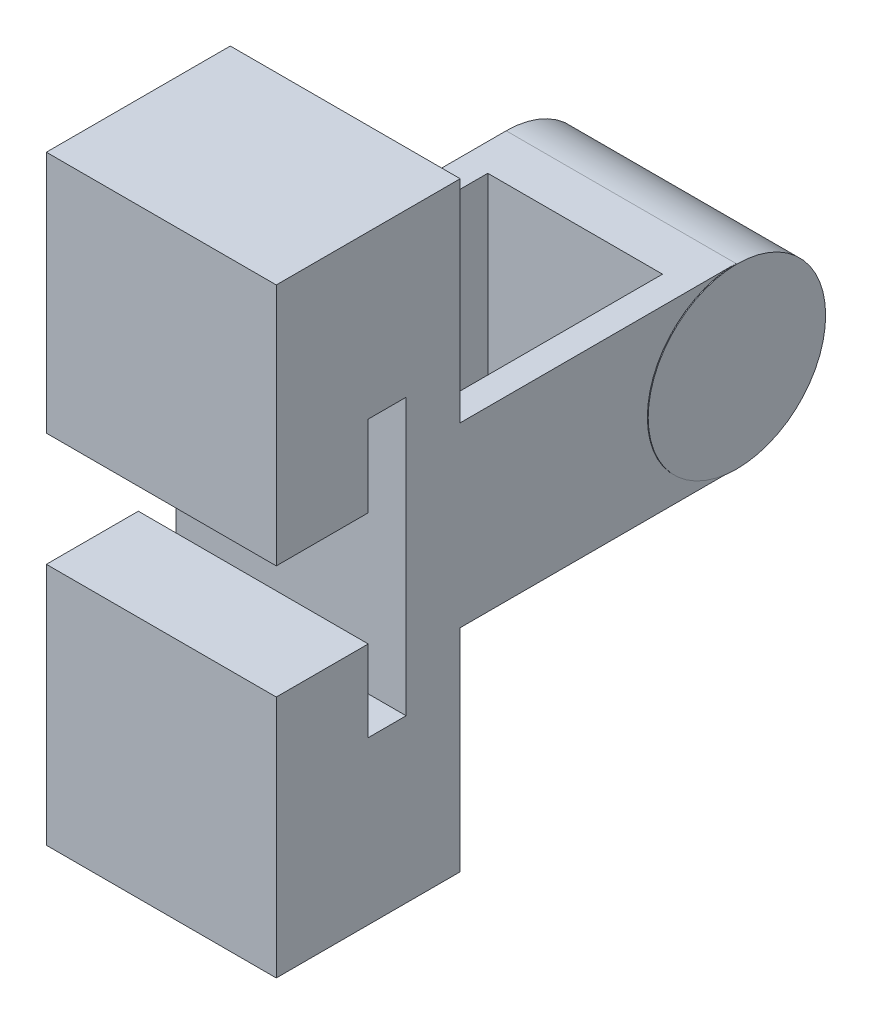
ISO-10303-21;
HEADER;
FILE_DESCRIPTION(('STEP AP214'),'2;1');
FILE_NAME('part.step','',(''),(''),'','','');
FILE_SCHEMA(('AUTOMOTIVE_DESIGN { 1 0 10303 214 1 1 1 1 }'));
ENDSEC;
DATA;
#1=APPLICATION_CONTEXT('core data for automotive mechanical design processes');
#2=APPLICATION_PROTOCOL_DEFINITION('international standard','automotive_design',2000,#1);
#3=PRODUCT_CONTEXT('',#1,'mechanical');
#4=PRODUCT('Part','Part','',(#3));
#5=PRODUCT_RELATED_PRODUCT_CATEGORY('part','',(#4));
#6=PRODUCT_DEFINITION_FORMATION('','',#4);
#7=PRODUCT_DEFINITION_CONTEXT('part definition',#1,'design');
#8=PRODUCT_DEFINITION('design','',#6,#7);
#9=PRODUCT_DEFINITION_SHAPE('','',#8);
#10=(LENGTH_UNIT() NAMED_UNIT(*) SI_UNIT(.MILLI.,.METRE.));
#11=(NAMED_UNIT(*) PLANE_ANGLE_UNIT() SI_UNIT($,.RADIAN.));
#12=(NAMED_UNIT(*) SI_UNIT($,.STERADIAN.) SOLID_ANGLE_UNIT());
#13=UNCERTAINTY_MEASURE_WITH_UNIT(LENGTH_MEASURE(1.E-05),#10,'distance_accuracy_value','');
#14=(GEOMETRIC_REPRESENTATION_CONTEXT(3) GLOBAL_UNCERTAINTY_ASSIGNED_CONTEXT((#13)) GLOBAL_UNIT_ASSIGNED_CONTEXT((#10,
#11,#12)) REPRESENTATION_CONTEXT('',''));
#15=CARTESIAN_POINT('',(0.,0.,0.));
#16=DIRECTION('',(0.,0.,1.));
#17=DIRECTION('',(1.,0.,0.));
#18=AXIS2_PLACEMENT_3D('',#15,#16,#17);
#19=CARTESIAN_POINT('',(0.,-38.1,0.));
#20=DIRECTION('',(0.,-1.,0.));
#21=DIRECTION('',(-1.,0.,0.));
#22=AXIS2_PLACEMENT_3D('',#19,#20,#21);
#23=PLANE('',#22);
#24=DIRECTION('',(-1.,0.,0.));
#25=VECTOR('',#24,1.);
#26=CARTESIAN_POINT('',(0.,-38.1,101.6));
#27=LINE('',#26,#25);
#28=CARTESIAN_POINT('',(0.,-38.1,101.6));
#29=VERTEX_POINT('',#28);
#30=CARTESIAN_POINT('',(-63.5,-38.1,101.6));
#31=VERTEX_POINT('',#30);
#32=EDGE_CURVE('E383',#29,#31,#27,.T.);
#33=ORIENTED_EDGE('',*,*,#32,.F.);
#34=DIRECTION('',(0.,0.,-1.));
#35=VECTOR('',#34,1.);
#36=CARTESIAN_POINT('',(0.,-38.1,127.));
#37=LINE('',#36,#35);
#38=CARTESIAN_POINT('',(0.,-38.1,91.1297825490581));
#39=VERTEX_POINT('',#38);
#40=EDGE_CURVE('E334',#29,#39,#37,.T.);
#41=ORIENTED_EDGE('',*,*,#40,.T.);
#42=DIRECTION('',(1.,0.,0.));
#43=VECTOR('',#42,1.);
#44=CARTESIAN_POINT('',(-63.5,-38.1,91.1297825490581));
#45=LINE('',#44,#43);
#46=CARTESIAN_POINT('',(-63.5,-38.1,91.1297825490581));
#47=VERTEX_POINT('',#46);
#48=EDGE_CURVE('E287',#47,#39,#45,.T.);
#49=ORIENTED_EDGE('',*,*,#48,.F.);
#50=DIRECTION('',(0.,0.,1.));
#51=VECTOR('',#50,1.);
#52=CARTESIAN_POINT('',(-63.5,-38.1,76.2));
#53=LINE('',#52,#51);
#54=EDGE_CURVE('E330',#47,#31,#53,.T.);
#55=ORIENTED_EDGE('',*,*,#54,.T.);
#56=EDGE_LOOP('',(#33,#41,#49,#55));
#57=FACE_BOUND('',#56,.T.);
#58=ADVANCED_FACE('F47',(#57),#23,.F.);
#59=CARTESIAN_POINT('',(0.,38.1,0.));
#60=DIRECTION('',(0.,1.,0.));
#61=DIRECTION('',(-1.,0.,0.));
#62=AXIS2_PLACEMENT_3D('',#59,#60,#61);
#63=PLANE('',#62);
#64=DIRECTION('',(1.,0.,0.));
#65=VECTOR('',#64,1.);
#66=CARTESIAN_POINT('',(0.,38.1,101.6));
#67=LINE('',#66,#65);
#68=CARTESIAN_POINT('',(-63.5,38.1,101.6));
#69=VERTEX_POINT('',#68);
#70=CARTESIAN_POINT('',(0.,38.1,101.6));
#71=VERTEX_POINT('',#70);
#72=EDGE_CURVE('E357',#69,#71,#67,.T.);
#73=ORIENTED_EDGE('',*,*,#72,.F.);
#74=DIRECTION('',(0.,0.,1.));
#75=VECTOR('',#74,1.);
#76=CARTESIAN_POINT('',(-63.5,38.1,76.2));
#77=LINE('',#76,#75);
#78=CARTESIAN_POINT('',(-63.5,38.1,91.1297825490581));
#79=VERTEX_POINT('',#78);
#80=EDGE_CURVE('E305',#79,#69,#77,.T.);
#81=ORIENTED_EDGE('',*,*,#80,.F.);
#82=DIRECTION('',(-1.,0.,0.));
#83=VECTOR('',#82,1.);
#84=CARTESIAN_POINT('',(0.,38.1,91.1297825490581));
#85=LINE('',#84,#83);
#86=CARTESIAN_POINT('',(0.,38.1,91.1297825490581));
#87=VERTEX_POINT('',#86);
#88=EDGE_CURVE('E295',#87,#79,#85,.T.);
#89=ORIENTED_EDGE('',*,*,#88,.F.);
#90=DIRECTION('',(0.,0.,-1.));
#91=VECTOR('',#90,1.);
#92=CARTESIAN_POINT('',(0.,38.1,127.));
#93=LINE('',#92,#91);
#94=EDGE_CURVE('E310',#71,#87,#93,.T.);
#95=ORIENTED_EDGE('',*,*,#94,.F.);
#96=EDGE_LOOP('',(#73,#81,#89,#95));
#97=FACE_BOUND('',#96,.T.);
#98=ADVANCED_FACE('F431',(#97),#63,.F.);
#99=CARTESIAN_POINT('',(0.2286,0.,0.));
#100=DIRECTION('',(-1.,0.,0.));
#101=DIRECTION('',(0.,0.,1.));
#102=AXIS2_PLACEMENT_3D('',#99,#100,#101);
#103=CYLINDRICAL_SURFACE('',#102,24.5059058177304);
#104=CARTESIAN_POINT('',(0.2286,0.,0.));
#105=DIRECTION('',(1.,0.,0.));
#106=DIRECTION('',(0.,0.,-1.));
#107=AXIS2_PLACEMENT_3D('',#104,#105,#106);
#108=CIRCLE('',#107,24.5059058177304);
#109=CARTESIAN_POINT('',(0.2286,0.,-24.5059058177304));
#110=VERTEX_POINT('',#109);
#111=EDGE_CURVE('E56',#110,#110,#108,.T.);
#112=ORIENTED_EDGE('',*,*,#111,.F.);
#113=EDGE_LOOP('',(#112));
#114=FACE_BOUND('',#113,.T.);
#115=CARTESIAN_POINT('',(0.,0.,0.));
#116=DIRECTION('',(1.,0.,0.));
#117=DIRECTION('',(0.,0.,-1.));
#118=AXIS2_PLACEMENT_3D('',#115,#116,#117);
#119=CIRCLE('',#118,24.5059058177304);
#120=CARTESIAN_POINT('',(0.,24.5059058177304,0.));
#121=VERTEX_POINT('',#120);
#122=CARTESIAN_POINT('',(0.,-24.5059058177304,0.));
#123=VERTEX_POINT('',#122);
#124=EDGE_CURVE('E217',#121,#123,#119,.T.);
#125=ORIENTED_EDGE('',*,*,#124,.T.);
#126=DIRECTION('',(1.,0.,0.));
#127=VECTOR('',#126,1.);
#128=CARTESIAN_POINT('',(-63.5,-24.5059058177304,0.));
#129=LINE('',#128,#127);
#130=CARTESIAN_POINT('',(-63.5,-24.5059058177304,0.));
#131=VERTEX_POINT('',#130);
#132=EDGE_CURVE('E211',#131,#123,#129,.T.);
#133=ORIENTED_EDGE('',*,*,#132,.F.);
#134=CARTESIAN_POINT('',(-63.5,0.,0.));
#135=DIRECTION('',(-1.,0.,0.));
#136=DIRECTION('',(0.,0.,1.));
#137=AXIS2_PLACEMENT_3D('',#134,#135,#136);
#138=CIRCLE('',#137,24.5059058177304);
#139=CARTESIAN_POINT('',(-63.5,24.5059058177304,0.));
#140=VERTEX_POINT('',#139);
#141=EDGE_CURVE('E252',#140,#131,#138,.T.);
#142=ORIENTED_EDGE('',*,*,#141,.F.);
#143=DIRECTION('',(1.,0.,0.));
#144=VECTOR('',#143,1.);
#145=CARTESIAN_POINT('',(-63.5,24.5059058177304,0.));
#146=LINE('',#145,#144);
#147=EDGE_CURVE('E232',#140,#121,#146,.T.);
#148=ORIENTED_EDGE('',*,*,#147,.T.);
#149=EDGE_LOOP('',(#125,#133,#142,#148));
#150=FACE_BOUND('',#149,.T.);
#151=ADVANCED_FACE('F49',(#114,#150),#103,.T.);
#152=CARTESIAN_POINT('',(0.2286,0.,0.));
#153=DIRECTION('',(1.,0.,0.));
#154=DIRECTION('',(0.,0.,-1.));
#155=AXIS2_PLACEMENT_3D('',#152,#153,#154);
#156=PLANE('',#155);
#157=ORIENTED_EDGE('',*,*,#111,.T.);
#158=EDGE_LOOP('',(#157));
#159=FACE_BOUND('',#158,.T.);
#160=ADVANCED_FACE('F469',(#159),#156,.T.);
#161=CARTESIAN_POINT('',(-63.5,-24.5059058177305,76.2));
#162=DIRECTION('',(0.,1.,0.));
#163=DIRECTION('',(0.,0.,1.));
#164=AXIS2_PLACEMENT_3D('',#161,#162,#163);
#165=PLANE('',#164);
#166=DIRECTION('',(1.,0.,0.));
#167=VECTOR('',#166,1.);
#168=CARTESIAN_POINT('',(-63.5,-24.5059058177305,76.2));
#169=LINE('',#168,#167);
#170=CARTESIAN_POINT('',(-7.61999999999999,-24.5059058177305,76.2));
#171=VERTEX_POINT('',#170);
#172=CARTESIAN_POINT('',(0.,-24.5059058177305,76.2));
#173=VERTEX_POINT('',#172);
#174=EDGE_CURVE('E212',#171,#173,#169,.T.);
#175=ORIENTED_EDGE('',*,*,#174,.F.);
#176=DIRECTION('',(0.,0.,1.));
#177=VECTOR('',#176,1.);
#178=CARTESIAN_POINT('',(-7.62,-24.5059058177305,76.2));
#179=LINE('',#178,#177);
#180=CARTESIAN_POINT('',(-7.61999999999999,-24.5059058177305,12.7));
#181=VERTEX_POINT('',#180);
#182=EDGE_CURVE('E63',#181,#171,#179,.T.);
#183=ORIENTED_EDGE('',*,*,#182,.F.);
#184=DIRECTION('',(1.,0.,0.));
#185=VECTOR('',#184,1.);
#186=CARTESIAN_POINT('',(-7.61999999999999,-24.5059058177305,12.7));
#187=LINE('',#186,#185);
#188=CARTESIAN_POINT('',(-55.88,-24.5059058177305,12.7));
#189=VERTEX_POINT('',#188);
#190=EDGE_CURVE('E204',#189,#181,#187,.T.);
#191=ORIENTED_EDGE('',*,*,#190,.F.);
#192=DIRECTION('',(0.,0.,-1.));
#193=VECTOR('',#192,1.);
#194=CARTESIAN_POINT('',(-55.88,-24.5059058177305,12.7));
#195=LINE('',#194,#193);
#196=CARTESIAN_POINT('',(-55.88,-24.5059058177305,76.2));
#197=VERTEX_POINT('',#196);
#198=EDGE_CURVE('E188',#197,#189,#195,.T.);
#199=ORIENTED_EDGE('',*,*,#198,.F.);
#200=CARTESIAN_POINT('',(-63.5,-24.5059058177305,76.2));
#201=VERTEX_POINT('',#200);
#202=EDGE_CURVE('E201',#201,#197,#169,.T.);
#203=ORIENTED_EDGE('',*,*,#202,.F.);
#204=DIRECTION('',(0.,0.,1.));
#205=VECTOR('',#204,1.);
#206=CARTESIAN_POINT('',(-63.5,-24.5059058177305,76.2));
#207=LINE('',#206,#205);
#208=EDGE_CURVE('E247',#131,#201,#207,.T.);
#209=ORIENTED_EDGE('',*,*,#208,.F.);
#210=ORIENTED_EDGE('',*,*,#132,.T.);
#211=DIRECTION('',(0.,0.,1.));
#212=VECTOR('',#211,1.);
#213=CARTESIAN_POINT('',(0.,-24.5059058177305,76.2));
#214=LINE('',#213,#212);
#215=EDGE_CURVE('E241',#123,#173,#214,.T.);
#216=ORIENTED_EDGE('',*,*,#215,.T.);
#217=EDGE_LOOP('',(#175,#183,#191,#199,#203,#209,#210,#216));
#218=FACE_BOUND('',#217,.T.);
#219=ADVANCED_FACE('F200',(#218),#165,.F.);
#220=CARTESIAN_POINT('',(-63.5,24.5059058177304,0.));
#221=DIRECTION('',(0.,-1.,0.));
#222=DIRECTION('',(0.,0.,-1.));
#223=AXIS2_PLACEMENT_3D('',#220,#221,#222);
#224=PLANE('',#223);
#225=DIRECTION('',(1.,0.,0.));
#226=VECTOR('',#225,1.);
#227=CARTESIAN_POINT('',(-63.5,24.5059058177305,12.7));
#228=LINE('',#227,#226);
#229=CARTESIAN_POINT('',(-55.88,24.5059058177305,12.7));
#230=VERTEX_POINT('',#229);
#231=CARTESIAN_POINT('',(-7.61999999999999,24.5059058177305,12.7));
#232=VERTEX_POINT('',#231);
#233=EDGE_CURVE('E11',#230,#232,#228,.T.);
#234=ORIENTED_EDGE('',*,*,#233,.T.);
#235=DIRECTION('',(0.,0.,1.));
#236=VECTOR('',#235,1.);
#237=CARTESIAN_POINT('',(-7.61999999999999,24.5059058177304,0.));
#238=LINE('',#237,#236);
#239=CARTESIAN_POINT('',(-7.62,24.5059058177305,76.2));
#240=VERTEX_POINT('',#239);
#241=EDGE_CURVE('E388',#232,#240,#238,.T.);
#242=ORIENTED_EDGE('',*,*,#241,.T.);
#243=DIRECTION('',(1.,0.,0.));
#244=VECTOR('',#243,1.);
#245=CARTESIAN_POINT('',(-63.5,24.5059058177305,76.2));
#246=LINE('',#245,#244);
#247=CARTESIAN_POINT('',(0.,24.5059058177305,76.2));
#248=VERTEX_POINT('',#247);
#249=EDGE_CURVE('E265',#240,#248,#246,.T.);
#250=ORIENTED_EDGE('',*,*,#249,.T.);
#251=DIRECTION('',(0.,0.,-1.));
#252=VECTOR('',#251,1.);
#253=CARTESIAN_POINT('',(0.,24.5059058177304,0.));
#254=LINE('',#253,#252);
#255=EDGE_CURVE('E237',#248,#121,#254,.T.);
#256=ORIENTED_EDGE('',*,*,#255,.T.);
#257=ORIENTED_EDGE('',*,*,#147,.F.);
#258=DIRECTION('',(0.,0.,-1.));
#259=VECTOR('',#258,1.);
#260=CARTESIAN_POINT('',(-63.5,24.5059058177304,0.));
#261=LINE('',#260,#259);
#262=CARTESIAN_POINT('',(-63.5,24.5059058177305,76.2));
#263=VERTEX_POINT('',#262);
#264=EDGE_CURVE('E251',#263,#140,#261,.T.);
#265=ORIENTED_EDGE('',*,*,#264,.F.);
#266=CARTESIAN_POINT('',(-55.88,24.5059058177305,76.2));
#267=VERTEX_POINT('',#266);
#268=EDGE_CURVE('E219',#263,#267,#246,.T.);
#269=ORIENTED_EDGE('',*,*,#268,.T.);
#270=DIRECTION('',(0.,0.,-1.));
#271=VECTOR('',#270,1.);
#272=CARTESIAN_POINT('',(-55.88,24.5059058177304,0.));
#273=LINE('',#272,#271);
#274=EDGE_CURVE('E191',#267,#230,#273,.T.);
#275=ORIENTED_EDGE('',*,*,#274,.T.);
#276=EDGE_LOOP('',(#234,#242,#250,#256,#257,#265,#269,#275));
#277=FACE_BOUND('',#276,.T.);
#278=ADVANCED_FACE('F271',(#277),#224,.F.);
#279=CARTESIAN_POINT('',(-63.5,0.,0.));
#280=DIRECTION('',(-1.,0.,0.));
#281=DIRECTION('',(0.,0.,1.));
#282=AXIS2_PLACEMENT_3D('',#279,#280,#281);
#283=PLANE('',#282);
#284=ORIENTED_EDGE('',*,*,#141,.T.);
#285=ORIENTED_EDGE('',*,*,#208,.T.);
#286=DIRECTION('',(0.,-1.,0.));
#287=VECTOR('',#286,1.);
#288=CARTESIAN_POINT('',(-63.5,38.1,76.2));
#289=LINE('',#288,#287);
#290=CARTESIAN_POINT('',(-63.5,-82.8893476471741,76.2));
#291=VERTEX_POINT('',#290);
#292=EDGE_CURVE('E209',#201,#291,#289,.T.);
#293=ORIENTED_EDGE('',*,*,#292,.T.);
#294=DIRECTION('',(0.,0.,1.));
#295=VECTOR('',#294,1.);
#296=CARTESIAN_POINT('',(-63.5,-82.8893476471741,76.2));
#297=LINE('',#296,#295);
#298=CARTESIAN_POINT('',(-63.5,-82.8893476471741,127.));
#299=VERTEX_POINT('',#298);
#300=EDGE_CURVE('E340',#291,#299,#297,.T.);
#301=ORIENTED_EDGE('',*,*,#300,.T.);
#302=DIRECTION('',(0.,1.,0.));
#303=VECTOR('',#302,1.);
#304=CARTESIAN_POINT('',(-63.5,-82.8893476471741,127.));
#305=LINE('',#304,#303);
#306=CARTESIAN_POINT('',(-63.5,-15.68196,127.));
#307=VERTEX_POINT('',#306);
#308=EDGE_CURVE('E326',#299,#307,#305,.T.);
#309=ORIENTED_EDGE('',*,*,#308,.T.);
#310=DIRECTION('',(0.,0.,1.));
#311=VECTOR('',#310,1.);
#312=CARTESIAN_POINT('',(-63.5,-15.68196,127.));
#313=LINE('',#312,#311);
#314=CARTESIAN_POINT('',(-63.5,-15.68196,101.6));
#315=VERTEX_POINT('',#314);
#316=EDGE_CURVE('E392',#315,#307,#313,.T.);
#317=ORIENTED_EDGE('',*,*,#316,.F.);
#318=DIRECTION('',(0.,-1.,0.));
#319=VECTOR('',#318,1.);
#320=CARTESIAN_POINT('',(-63.5,-15.68196,101.6));
#321=LINE('',#320,#319);
#322=EDGE_CURVE('E378',#315,#31,#321,.T.);
#323=ORIENTED_EDGE('',*,*,#322,.T.);
#324=ORIENTED_EDGE('',*,*,#54,.F.);
#325=DIRECTION('',(0.,-1.,0.));
#326=VECTOR('',#325,1.);
#327=CARTESIAN_POINT('',(-63.5,38.1,91.1297825490581));
#328=LINE('',#327,#326);
#329=EDGE_CURVE('E291',#79,#47,#328,.T.);
#330=ORIENTED_EDGE('',*,*,#329,.F.);
#331=ORIENTED_EDGE('',*,*,#80,.T.);
#332=DIRECTION('',(0.,1.,0.));
#333=VECTOR('',#332,1.);
#334=CARTESIAN_POINT('',(-63.5,15.68196,101.6));
#335=LINE('',#334,#333);
#336=CARTESIAN_POINT('',(-63.5,15.68196,101.6));
#337=VERTEX_POINT('',#336);
#338=EDGE_CURVE('E337',#337,#69,#335,.T.);
#339=ORIENTED_EDGE('',*,*,#338,.F.);
#340=DIRECTION('',(0.,0.,-1.));
#341=VECTOR('',#340,1.);
#342=CARTESIAN_POINT('',(-63.5,15.68196,101.6));
#343=LINE('',#342,#341);
#344=CARTESIAN_POINT('',(-63.5,15.68196,127.));
#345=VERTEX_POINT('',#344);
#346=EDGE_CURVE('E360',#345,#337,#343,.T.);
#347=ORIENTED_EDGE('',*,*,#346,.F.);
#348=DIRECTION('',(0.,-1.,0.));
#349=VECTOR('',#348,1.);
#350=CARTESIAN_POINT('',(-63.5,82.8893476471741,127.));
#351=LINE('',#350,#349);
#352=CARTESIAN_POINT('',(-63.5,82.8893476471741,127.));
#353=VERTEX_POINT('',#352);
#354=EDGE_CURVE('E282',#353,#345,#351,.T.);
#355=ORIENTED_EDGE('',*,*,#354,.F.);
#356=DIRECTION('',(0.,0.,1.));
#357=VECTOR('',#356,1.);
#358=CARTESIAN_POINT('',(-63.5,82.8893476471741,76.2));
#359=LINE('',#358,#357);
#360=CARTESIAN_POINT('',(-63.5,82.8893476471741,76.2));
#361=VERTEX_POINT('',#360);
#362=EDGE_CURVE('E277',#361,#353,#359,.T.);
#363=ORIENTED_EDGE('',*,*,#362,.F.);
#364=EDGE_CURVE('E274',#361,#263,#289,.T.);
#365=ORIENTED_EDGE('',*,*,#364,.T.);
#366=ORIENTED_EDGE('',*,*,#264,.T.);
#367=EDGE_LOOP('',(#284,#285,#293,#301,#309,#317,#323,#324,#330,#331,#339,#347,#355,#363,#365,#366));
#368=FACE_BOUND('',#367,.T.);
#369=ADVANCED_FACE('F254',(#368),#283,.T.);
#370=CARTESIAN_POINT('',(0.,0.,0.));
#371=DIRECTION('',(-1.,0.,0.));
#372=DIRECTION('',(0.,0.,1.));
#373=AXIS2_PLACEMENT_3D('',#370,#371,#372);
#374=PLANE('',#373);
#375=ORIENTED_EDGE('',*,*,#124,.F.);
#376=ORIENTED_EDGE('',*,*,#255,.F.);
#377=DIRECTION('',(0.,1.,0.));
#378=VECTOR('',#377,1.);
#379=CARTESIAN_POINT('',(0.,-38.1,76.2));
#380=LINE('',#379,#378);
#381=CARTESIAN_POINT('',(0.,82.8893476471742,76.2));
#382=VERTEX_POINT('',#381);
#383=EDGE_CURVE('E279',#248,#382,#380,.T.);
#384=ORIENTED_EDGE('',*,*,#383,.T.);
#385=DIRECTION('',(0.,0.,-1.));
#386=VECTOR('',#385,1.);
#387=CARTESIAN_POINT('',(0.,82.8893476471742,127.));
#388=LINE('',#387,#386);
#389=CARTESIAN_POINT('',(0.,82.8893476471742,127.));
#390=VERTEX_POINT('',#389);
#391=EDGE_CURVE('E309',#390,#382,#388,.T.);
#392=ORIENTED_EDGE('',*,*,#391,.F.);
#393=DIRECTION('',(0.,-1.,0.));
#394=VECTOR('',#393,1.);
#395=CARTESIAN_POINT('',(0.,82.8893476471742,127.));
#396=LINE('',#395,#394);
#397=CARTESIAN_POINT('',(0.,15.68196,127.));
#398=VERTEX_POINT('',#397);
#399=EDGE_CURVE('E301',#390,#398,#396,.T.);
#400=ORIENTED_EDGE('',*,*,#399,.T.);
#401=DIRECTION('',(0.,0.,1.));
#402=VECTOR('',#401,1.);
#403=CARTESIAN_POINT('',(0.,15.68196,127.));
#404=LINE('',#403,#402);
#405=CARTESIAN_POINT('',(0.,15.68196,101.6));
#406=VERTEX_POINT('',#405);
#407=EDGE_CURVE('E365',#406,#398,#404,.T.);
#408=ORIENTED_EDGE('',*,*,#407,.F.);
#409=DIRECTION('',(0.,1.,0.));
#410=VECTOR('',#409,1.);
#411=CARTESIAN_POINT('',(0.,15.68196,101.6));
#412=LINE('',#411,#410);
#413=EDGE_CURVE('E352',#406,#71,#412,.T.);
#414=ORIENTED_EDGE('',*,*,#413,.T.);
#415=ORIENTED_EDGE('',*,*,#94,.T.);
#416=DIRECTION('',(0.,1.,0.));
#417=VECTOR('',#416,1.);
#418=CARTESIAN_POINT('',(0.,-38.1,91.1297825490581));
#419=LINE('',#418,#417);
#420=EDGE_CURVE('E245',#39,#87,#419,.T.);
#421=ORIENTED_EDGE('',*,*,#420,.F.);
#422=ORIENTED_EDGE('',*,*,#40,.F.);
#423=DIRECTION('',(0.,-1.,0.));
#424=VECTOR('',#423,1.);
#425=CARTESIAN_POINT('',(0.,-15.68196,101.6));
#426=LINE('',#425,#424);
#427=CARTESIAN_POINT('',(0.,-15.68196,101.6));
#428=VERTEX_POINT('',#427);
#429=EDGE_CURVE('E361',#428,#29,#426,.T.);
#430=ORIENTED_EDGE('',*,*,#429,.F.);
#431=DIRECTION('',(0.,0.,-1.));
#432=VECTOR('',#431,1.);
#433=CARTESIAN_POINT('',(0.,-15.68196,127.));
#434=LINE('',#433,#432);
#435=CARTESIAN_POINT('',(0.,-15.68196,127.));
#436=VERTEX_POINT('',#435);
#437=EDGE_CURVE('E387',#436,#428,#434,.T.);
#438=ORIENTED_EDGE('',*,*,#437,.F.);
#439=DIRECTION('',(0.,1.,0.));
#440=VECTOR('',#439,1.);
#441=CARTESIAN_POINT('',(0.,-82.8893476471742,127.));
#442=LINE('',#441,#440);
#443=CARTESIAN_POINT('',(0.,-82.8893476471742,127.));
#444=VERTEX_POINT('',#443);
#445=EDGE_CURVE('E313',#444,#436,#442,.T.);
#446=ORIENTED_EDGE('',*,*,#445,.F.);
#447=DIRECTION('',(0.,0.,-1.));
#448=VECTOR('',#447,1.);
#449=CARTESIAN_POINT('',(0.,-82.8893476471742,127.));
#450=LINE('',#449,#448);
#451=CARTESIAN_POINT('',(0.,-82.8893476471742,76.2));
#452=VERTEX_POINT('',#451);
#453=EDGE_CURVE('E333',#444,#452,#450,.T.);
#454=ORIENTED_EDGE('',*,*,#453,.T.);
#455=EDGE_CURVE('E243',#452,#173,#380,.T.);
#456=ORIENTED_EDGE('',*,*,#455,.T.);
#457=ORIENTED_EDGE('',*,*,#215,.F.);
#458=EDGE_LOOP('',(#375,#376,#384,#392,#400,#408,#414,#415,#421,#422,#430,#438,#446,#454,#456,#457));
#459=FACE_BOUND('',#458,.T.);
#460=ADVANCED_FACE('F236',(#459),#374,.F.);
#461=CARTESIAN_POINT('',(0.,0.,76.2));
#462=DIRECTION('',(0.,0.,1.));
#463=DIRECTION('',(1.,0.,0.));
#464=AXIS2_PLACEMENT_3D('',#461,#462,#463);
#465=PLANE('',#464);
#466=ORIENTED_EDGE('',*,*,#292,.F.);
#467=ORIENTED_EDGE('',*,*,#202,.T.);
#468=DIRECTION('',(0.,-1.,0.));
#469=VECTOR('',#468,1.);
#470=CARTESIAN_POINT('',(-55.88,82.8893476471742,76.2));
#471=LINE('',#470,#469);
#472=EDGE_CURVE('E71',#267,#197,#471,.T.);
#473=ORIENTED_EDGE('',*,*,#472,.F.);
#474=ORIENTED_EDGE('',*,*,#268,.F.);
#475=ORIENTED_EDGE('',*,*,#364,.F.);
#476=DIRECTION('',(-1.,0.,0.));
#477=VECTOR('',#476,1.);
#478=CARTESIAN_POINT('',(0.,82.8893476471742,76.2));
#479=LINE('',#478,#477);
#480=EDGE_CURVE('E318',#382,#361,#479,.T.);
#481=ORIENTED_EDGE('',*,*,#480,.F.);
#482=ORIENTED_EDGE('',*,*,#383,.F.);
#483=ORIENTED_EDGE('',*,*,#249,.F.);
#484=DIRECTION('',(0.,-1.,0.));
#485=VECTOR('',#484,1.);
#486=CARTESIAN_POINT('',(-7.62,82.8893476471742,76.2));
#487=LINE('',#486,#485);
#488=EDGE_CURVE('E195',#240,#171,#487,.T.);
#489=ORIENTED_EDGE('',*,*,#488,.T.);
#490=ORIENTED_EDGE('',*,*,#174,.T.);
#491=ORIENTED_EDGE('',*,*,#455,.F.);
#492=DIRECTION('',(-1.,0.,0.));
#493=VECTOR('',#492,1.);
#494=CARTESIAN_POINT('',(0.,-82.8893476471742,76.2));
#495=LINE('',#494,#493);
#496=EDGE_CURVE('E329',#452,#291,#495,.T.);
#497=ORIENTED_EDGE('',*,*,#496,.T.);
#498=EDGE_LOOP('',(#466,#467,#473,#474,#475,#481,#482,#483,#489,#490,#491,#497));
#499=FACE_BOUND('',#498,.T.);
#500=ADVANCED_FACE('F207',(#499),#465,.F.);
#501=CARTESIAN_POINT('',(0.,0.,91.1297825490581));
#502=DIRECTION('',(0.,0.,1.));
#503=DIRECTION('',(1.,0.,0.));
#504=AXIS2_PLACEMENT_3D('',#501,#502,#503);
#505=PLANE('',#504);
#506=ORIENTED_EDGE('',*,*,#88,.T.);
#507=ORIENTED_EDGE('',*,*,#329,.T.);
#508=ORIENTED_EDGE('',*,*,#48,.T.);
#509=ORIENTED_EDGE('',*,*,#420,.T.);
#510=EDGE_LOOP('',(#506,#507,#508,#509));
#511=FACE_BOUND('',#510,.T.);
#512=ADVANCED_FACE('F456',(#511),#505,.T.);
#513=CARTESIAN_POINT('',(-63.5,82.8893476471741,127.));
#514=DIRECTION('',(0.,0.,-1.));
#515=DIRECTION('',(-1.,0.,0.));
#516=AXIS2_PLACEMENT_3D('',#513,#514,#515);
#517=PLANE('',#516);
#518=ORIENTED_EDGE('',*,*,#354,.T.);
#519=DIRECTION('',(-1.,0.,0.));
#520=VECTOR('',#519,1.);
#521=CARTESIAN_POINT('',(-63.5,15.68196,127.));
#522=LINE('',#521,#520);
#523=EDGE_CURVE('E356',#398,#345,#522,.T.);
#524=ORIENTED_EDGE('',*,*,#523,.F.);
#525=ORIENTED_EDGE('',*,*,#399,.F.);
#526=DIRECTION('',(1.,0.,0.));
#527=VECTOR('',#526,1.);
#528=CARTESIAN_POINT('',(-63.5,82.8893476471741,127.));
#529=LINE('',#528,#527);
#530=EDGE_CURVE('E304',#353,#390,#529,.T.);
#531=ORIENTED_EDGE('',*,*,#530,.F.);
#532=EDGE_LOOP('',(#518,#524,#525,#531));
#533=FACE_BOUND('',#532,.T.);
#534=ADVANCED_FACE('F451',(#533),#517,.F.);
#535=CARTESIAN_POINT('',(0.,82.8893476471742,0.));
#536=DIRECTION('',(0.,1.,0.));
#537=DIRECTION('',(-1.,0.,0.));
#538=AXIS2_PLACEMENT_3D('',#535,#536,#537);
#539=PLANE('',#538);
#540=ORIENTED_EDGE('',*,*,#391,.T.);
#541=ORIENTED_EDGE('',*,*,#480,.T.);
#542=ORIENTED_EDGE('',*,*,#362,.T.);
#543=ORIENTED_EDGE('',*,*,#530,.T.);
#544=EDGE_LOOP('',(#540,#541,#542,#543));
#545=FACE_BOUND('',#544,.T.);
#546=ADVANCED_FACE('F448',(#545),#539,.T.);
#547=CARTESIAN_POINT('',(-63.5,-82.8893476471741,127.));
#548=DIRECTION('',(0.,0.,1.));
#549=DIRECTION('',(1.,0.,0.));
#550=AXIS2_PLACEMENT_3D('',#547,#548,#549);
#551=PLANE('',#550);
#552=ORIENTED_EDGE('',*,*,#445,.T.);
#553=DIRECTION('',(1.,0.,0.));
#554=VECTOR('',#553,1.);
#555=CARTESIAN_POINT('',(0.,-15.68196,127.));
#556=LINE('',#555,#554);
#557=EDGE_CURVE('E382',#307,#436,#556,.T.);
#558=ORIENTED_EDGE('',*,*,#557,.F.);
#559=ORIENTED_EDGE('',*,*,#308,.F.);
#560=DIRECTION('',(1.,0.,0.));
#561=VECTOR('',#560,1.);
#562=CARTESIAN_POINT('',(-63.5,-82.8893476471741,127.));
#563=LINE('',#562,#561);
#564=EDGE_CURVE('E344',#299,#444,#563,.T.);
#565=ORIENTED_EDGE('',*,*,#564,.T.);
#566=EDGE_LOOP('',(#552,#558,#559,#565));
#567=FACE_BOUND('',#566,.T.);
#568=ADVANCED_FACE('F445',(#567),#551,.T.);
#569=CARTESIAN_POINT('',(0.,-82.8893476471742,0.));
#570=DIRECTION('',(0.,-1.,0.));
#571=DIRECTION('',(-1.,0.,0.));
#572=AXIS2_PLACEMENT_3D('',#569,#570,#571);
#573=PLANE('',#572);
#574=ORIENTED_EDGE('',*,*,#453,.F.);
#575=ORIENTED_EDGE('',*,*,#564,.F.);
#576=ORIENTED_EDGE('',*,*,#300,.F.);
#577=ORIENTED_EDGE('',*,*,#496,.F.);
#578=EDGE_LOOP('',(#574,#575,#576,#577));
#579=FACE_BOUND('',#578,.T.);
#580=ADVANCED_FACE('F443',(#579),#573,.T.);
#581=CARTESIAN_POINT('',(0.,15.68196,101.6));
#582=DIRECTION('',(0.,0.,1.));
#583=DIRECTION('',(0.,-1.,0.));
#584=AXIS2_PLACEMENT_3D('',#581,#582,#583);
#585=PLANE('',#584);
#586=ORIENTED_EDGE('',*,*,#72,.T.);
#587=ORIENTED_EDGE('',*,*,#413,.F.);
#588=DIRECTION('',(1.,0.,0.));
#589=VECTOR('',#588,1.);
#590=CARTESIAN_POINT('',(0.,15.68196,101.6));
#591=LINE('',#590,#589);
#592=EDGE_CURVE('E369',#337,#406,#591,.T.);
#593=ORIENTED_EDGE('',*,*,#592,.F.);
#594=ORIENTED_EDGE('',*,*,#338,.T.);
#595=EDGE_LOOP('',(#586,#587,#593,#594));
#596=FACE_BOUND('',#595,.T.);
#597=ADVANCED_FACE('F493',(#596),#585,.F.);
#598=CARTESIAN_POINT('',(0.,15.68196,0.));
#599=DIRECTION('',(0.,1.,0.));
#600=DIRECTION('',(-1.,0.,0.));
#601=AXIS2_PLACEMENT_3D('',#598,#599,#600);
#602=PLANE('',#601);
#603=ORIENTED_EDGE('',*,*,#346,.T.);
#604=ORIENTED_EDGE('',*,*,#592,.T.);
#605=ORIENTED_EDGE('',*,*,#407,.T.);
#606=ORIENTED_EDGE('',*,*,#523,.T.);
#607=EDGE_LOOP('',(#603,#604,#605,#606));
#608=FACE_BOUND('',#607,.T.);
#609=ADVANCED_FACE('F513',(#608),#602,.F.);
#610=CARTESIAN_POINT('',(0.,-15.68196,101.6));
#611=DIRECTION('',(0.,0.,1.));
#612=DIRECTION('',(0.,-1.,0.));
#613=AXIS2_PLACEMENT_3D('',#610,#611,#612);
#614=PLANE('',#613);
#615=ORIENTED_EDGE('',*,*,#32,.T.);
#616=ORIENTED_EDGE('',*,*,#322,.F.);
#617=DIRECTION('',(-1.,0.,0.));
#618=VECTOR('',#617,1.);
#619=CARTESIAN_POINT('',(0.,-15.68196,101.6));
#620=LINE('',#619,#618);
#621=EDGE_CURVE('E396',#428,#315,#620,.T.);
#622=ORIENTED_EDGE('',*,*,#621,.F.);
#623=ORIENTED_EDGE('',*,*,#429,.T.);
#624=EDGE_LOOP('',(#615,#616,#622,#623));
#625=FACE_BOUND('',#624,.T.);
#626=ADVANCED_FACE('F519',(#625),#614,.F.);
#627=CARTESIAN_POINT('',(0.,-15.68196,0.));
#628=DIRECTION('',(0.,1.,0.));
#629=DIRECTION('',(-1.,0.,0.));
#630=AXIS2_PLACEMENT_3D('',#627,#628,#629);
#631=PLANE('',#630);
#632=ORIENTED_EDGE('',*,*,#437,.T.);
#633=ORIENTED_EDGE('',*,*,#621,.T.);
#634=ORIENTED_EDGE('',*,*,#316,.T.);
#635=ORIENTED_EDGE('',*,*,#557,.T.);
#636=EDGE_LOOP('',(#632,#633,#634,#635));
#637=FACE_BOUND('',#636,.T.);
#638=ADVANCED_FACE('F427',(#637),#631,.T.);
#639=CARTESIAN_POINT('',(-7.61999999999999,82.8893476471742,12.7));
#640=DIRECTION('',(0.,0.,-1.));
#641=DIRECTION('',(0.,1.,0.));
#642=AXIS2_PLACEMENT_3D('',#639,#640,#641);
#643=PLANE('',#642);
#644=DIRECTION('',(0.,-1.,0.));
#645=VECTOR('',#644,1.);
#646=CARTESIAN_POINT('',(-55.88,82.8893476471742,12.7));
#647=LINE('',#646,#645);
#648=EDGE_CURVE('E194',#230,#189,#647,.T.);
#649=ORIENTED_EDGE('',*,*,#648,.T.);
#650=ORIENTED_EDGE('',*,*,#190,.T.);
#651=DIRECTION('',(0.,-1.,0.));
#652=VECTOR('',#651,1.);
#653=CARTESIAN_POINT('',(-7.61999999999999,82.8893476471742,12.7));
#654=LINE('',#653,#652);
#655=EDGE_CURVE('E406',#232,#181,#654,.T.);
#656=ORIENTED_EDGE('',*,*,#655,.F.);
#657=ORIENTED_EDGE('',*,*,#233,.F.);
#658=EDGE_LOOP('',(#649,#650,#656,#657));
#659=FACE_BOUND('',#658,.T.);
#660=ADVANCED_FACE('F418',(#659),#643,.F.);
#661=CARTESIAN_POINT('',(-7.62,82.8893476471742,76.2));
#662=DIRECTION('',(1.,0.,0.));
#663=DIRECTION('',(0.,0.,-1.));
#664=AXIS2_PLACEMENT_3D('',#661,#662,#663);
#665=PLANE('',#664);
#666=ORIENTED_EDGE('',*,*,#655,.T.);
#667=ORIENTED_EDGE('',*,*,#182,.T.);
#668=ORIENTED_EDGE('',*,*,#488,.F.);
#669=ORIENTED_EDGE('',*,*,#241,.F.);
#670=EDGE_LOOP('',(#666,#667,#668,#669));
#671=FACE_BOUND('',#670,.T.);
#672=ADVANCED_FACE('F419',(#671),#665,.F.);
#673=CARTESIAN_POINT('',(-55.88,82.8893476471742,12.7));
#674=DIRECTION('',(-1.,0.,0.));
#675=DIRECTION('',(0.,0.,1.));
#676=AXIS2_PLACEMENT_3D('',#673,#674,#675);
#677=PLANE('',#676);
#678=ORIENTED_EDGE('',*,*,#472,.T.);
#679=ORIENTED_EDGE('',*,*,#198,.T.);
#680=ORIENTED_EDGE('',*,*,#648,.F.);
#681=ORIENTED_EDGE('',*,*,#274,.F.);
#682=EDGE_LOOP('',(#678,#679,#680,#681));
#683=FACE_BOUND('',#682,.T.);
#684=ADVANCED_FACE('F186',(#683),#677,.F.);
#685=CLOSED_SHELL('',(#58,#98,#151,#160,#219,#278,#369,#460,#500,#512,#534,#546,#568,#580,#597,
#609,#626,#638,#660,#672,#684));
#686=MANIFOLD_SOLID_BREP('B2',#685);
#687=ADVANCED_BREP_SHAPE_REPRESENTATION('',(#18,#686),#14);
#688=SHAPE_DEFINITION_REPRESENTATION(#9,#687);
ENDSEC;
END-ISO-10303-21;
